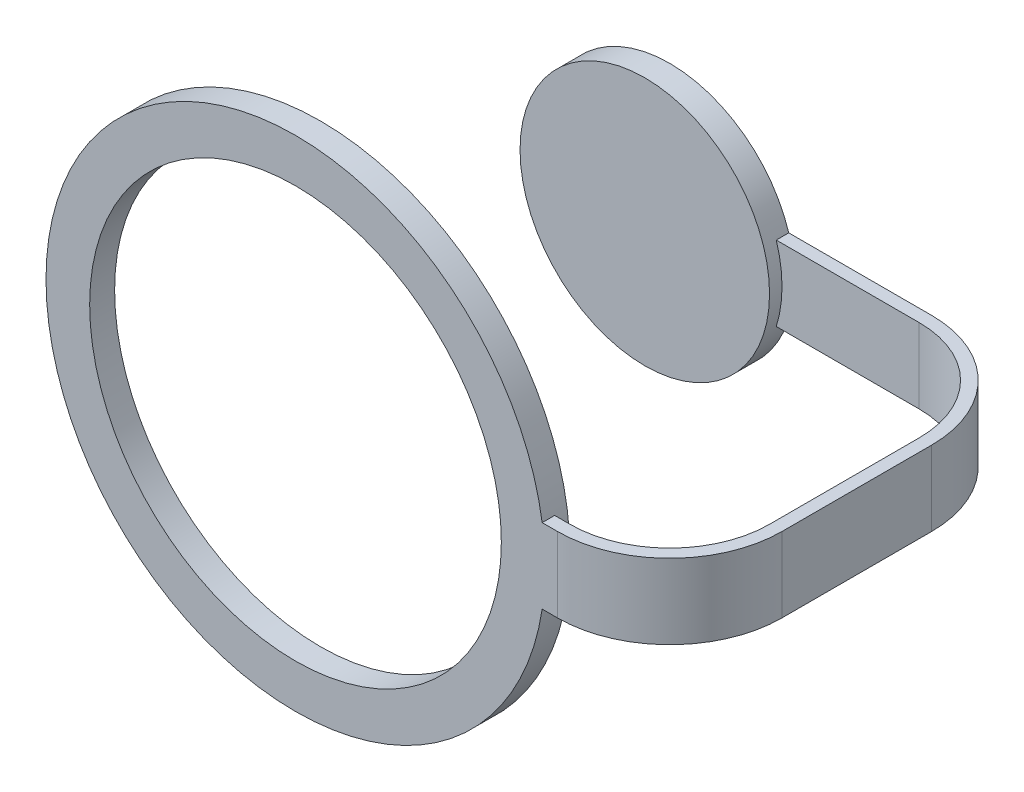
ISO-10303-21;
HEADER;
FILE_DESCRIPTION(('STEP AP214'),'2;1');
FILE_NAME('part.step','',(''),(''),'','','');
FILE_SCHEMA(('AUTOMOTIVE_DESIGN { 1 0 10303 214 1 1 1 1 }'));
ENDSEC;
DATA;
#1=APPLICATION_CONTEXT('core data for automotive mechanical design processes');
#2=APPLICATION_PROTOCOL_DEFINITION('international standard','automotive_design',2000,#1);
#3=PRODUCT_CONTEXT('',#1,'mechanical');
#4=PRODUCT('Part','Part','',(#3));
#5=PRODUCT_RELATED_PRODUCT_CATEGORY('part','',(#4));
#6=PRODUCT_DEFINITION_FORMATION('','',#4);
#7=PRODUCT_DEFINITION_CONTEXT('part definition',#1,'design');
#8=PRODUCT_DEFINITION('design','',#6,#7);
#9=PRODUCT_DEFINITION_SHAPE('','',#8);
#10=(LENGTH_UNIT() NAMED_UNIT(*) SI_UNIT(.MILLI.,.METRE.));
#11=(NAMED_UNIT(*) PLANE_ANGLE_UNIT() SI_UNIT($,.RADIAN.));
#12=(NAMED_UNIT(*) SI_UNIT($,.STERADIAN.) SOLID_ANGLE_UNIT());
#13=UNCERTAINTY_MEASURE_WITH_UNIT(LENGTH_MEASURE(1.E-05),#10,'distance_accuracy_value','');
#14=(GEOMETRIC_REPRESENTATION_CONTEXT(3) GLOBAL_UNCERTAINTY_ASSIGNED_CONTEXT((#13)) GLOBAL_UNIT_ASSIGNED_CONTEXT((#10,
#11,#12)) REPRESENTATION_CONTEXT('',''));
#15=CARTESIAN_POINT('',(0.,0.,0.));
#16=DIRECTION('',(0.,0.,1.));
#17=DIRECTION('',(1.,0.,0.));
#18=AXIS2_PLACEMENT_3D('',#15,#16,#17);
#19=CARTESIAN_POINT('',(0.,0.,14.));
#20=DIRECTION('',(0.,0.,1.));
#21=DIRECTION('',(1.,0.,0.));
#22=AXIS2_PLACEMENT_3D('',#19,#20,#21);
#23=PLANE('',#22);
#24=CARTESIAN_POINT('',(0.,0.,14.));
#25=DIRECTION('',(0.,0.,1.));
#26=DIRECTION('',(1.,0.,0.));
#27=AXIS2_PLACEMENT_3D('',#24,#25,#26);
#28=CIRCLE('',#27,10.);
#29=CARTESIAN_POINT('',(9.88685996664259,1.5,14.));
#30=VERTEX_POINT('',#29);
#31=CARTESIAN_POINT('',(9.88685996664259,-1.5,14.));
#32=VERTEX_POINT('',#31);
#33=EDGE_CURVE('E210',#30,#32,#28,.T.);
#34=ORIENTED_EDGE('',*,*,#33,.T.);
#35=DIRECTION('',(1.,0.,0.));
#36=VECTOR('',#35,1.);
#37=CARTESIAN_POINT('',(10.,-1.5,14.));
#38=LINE('',#37,#36);
#39=CARTESIAN_POINT('',(10.5,-1.5,14.));
#40=VERTEX_POINT('',#39);
#41=EDGE_CURVE('E162',#32,#40,#38,.T.);
#42=ORIENTED_EDGE('',*,*,#41,.T.);
#43=DIRECTION('',(0.,1.,0.));
#44=VECTOR('',#43,1.);
#45=CARTESIAN_POINT('',(10.5,-1.5,14.));
#46=LINE('',#45,#44);
#47=CARTESIAN_POINT('',(10.5,1.5,14.));
#48=VERTEX_POINT('',#47);
#49=EDGE_CURVE('E185',#40,#48,#46,.T.);
#50=ORIENTED_EDGE('',*,*,#49,.T.);
#51=DIRECTION('',(1.,0.,0.));
#52=VECTOR('',#51,1.);
#53=CARTESIAN_POINT('',(10.,1.5,14.));
#54=LINE('',#53,#52);
#55=EDGE_CURVE('E218',#30,#48,#54,.T.);
#56=ORIENTED_EDGE('',*,*,#55,.F.);
#57=EDGE_LOOP('',(#34,#42,#50,#56));
#58=FACE_BOUND('',#57,.T.);
#59=CARTESIAN_POINT('',(0.,0.,14.));
#60=DIRECTION('',(0.,0.,1.));
#61=DIRECTION('',(1.,0.,0.));
#62=AXIS2_PLACEMENT_3D('',#59,#60,#61);
#63=CIRCLE('',#62,8.25);
#64=CARTESIAN_POINT('',(8.25,0.,14.));
#65=VERTEX_POINT('',#64);
#66=EDGE_CURVE('E204',#65,#65,#63,.T.);
#67=ORIENTED_EDGE('',*,*,#66,.F.);
#68=EDGE_LOOP('',(#67));
#69=FACE_BOUND('',#68,.T.);
#70=ADVANCED_FACE('F32',(#58,#69),#23,.T.);
#71=CARTESIAN_POINT('',(0.,0.,13.));
#72=DIRECTION('',(0.,0.,1.));
#73=DIRECTION('',(1.,0.,0.));
#74=AXIS2_PLACEMENT_3D('',#71,#72,#73);
#75=PLANE('',#74);
#76=CARTESIAN_POINT('',(0.,0.,13.));
#77=DIRECTION('',(0.,0.,1.));
#78=DIRECTION('',(1.,0.,0.));
#79=AXIS2_PLACEMENT_3D('',#76,#77,#78);
#80=CIRCLE('',#79,10.);
#81=CARTESIAN_POINT('',(10.,0.,13.));
#82=VERTEX_POINT('',#81);
#83=EDGE_CURVE('E207',#82,#82,#80,.T.);
#84=ORIENTED_EDGE('',*,*,#83,.F.);
#85=EDGE_LOOP('',(#84));
#86=FACE_BOUND('',#85,.T.);
#87=CARTESIAN_POINT('',(0.,0.,13.));
#88=DIRECTION('',(0.,0.,1.));
#89=DIRECTION('',(1.,0.,0.));
#90=AXIS2_PLACEMENT_3D('',#87,#88,#89);
#91=CIRCLE('',#90,8.25);
#92=CARTESIAN_POINT('',(8.25,0.,13.));
#93=VERTEX_POINT('',#92);
#94=EDGE_CURVE('E188',#93,#93,#91,.T.);
#95=ORIENTED_EDGE('',*,*,#94,.T.);
#96=EDGE_LOOP('',(#95));
#97=FACE_BOUND('',#96,.T.);
#98=ADVANCED_FACE('F260',(#86,#97),#75,.F.);
#99=CARTESIAN_POINT('',(0.,0.,14.));
#100=DIRECTION('',(0.,0.,-1.));
#101=DIRECTION('',(-1.,0.,0.));
#102=AXIS2_PLACEMENT_3D('',#99,#100,#101);
#103=CYLINDRICAL_SURFACE('',#102,10.);
#104=CARTESIAN_POINT('',(0.,0.,13.5));
#105=DIRECTION('',(0.,0.,-1.));
#106=DIRECTION('',(-1.,0.,0.));
#107=AXIS2_PLACEMENT_3D('',#104,#105,#106);
#108=CIRCLE('',#107,10.);
#109=CARTESIAN_POINT('',(9.88685996664259,1.5,13.5));
#110=VERTEX_POINT('',#109);
#111=CARTESIAN_POINT('',(9.88685996664259,-1.5,13.5));
#112=VERTEX_POINT('',#111);
#113=EDGE_CURVE('E40',#110,#112,#108,.T.);
#114=ORIENTED_EDGE('',*,*,#113,.T.);
#115=DIRECTION('',(0.,0.,-1.));
#116=VECTOR('',#115,1.);
#117=CARTESIAN_POINT('',(9.88685996664259,-1.5,14.));
#118=LINE('',#117,#116);
#119=EDGE_CURVE('E11',#112,#32,#118,.F.);
#120=ORIENTED_EDGE('',*,*,#119,.T.);
#121=ORIENTED_EDGE('',*,*,#33,.F.);
#122=DIRECTION('',(0.,0.,-1.));
#123=VECTOR('',#122,1.);
#124=CARTESIAN_POINT('',(9.88685996664259,1.5,14.));
#125=LINE('',#124,#123);
#126=EDGE_CURVE('E50',#110,#30,#125,.F.);
#127=ORIENTED_EDGE('',*,*,#126,.F.);
#128=EDGE_LOOP('',(#114,#120,#121,#127));
#129=FACE_BOUND('',#128,.T.);
#130=ORIENTED_EDGE('',*,*,#83,.T.);
#131=EDGE_LOOP('',(#130));
#132=FACE_BOUND('',#131,.T.);
#133=ADVANCED_FACE('F34',(#129,#132),#103,.T.);
#134=CARTESIAN_POINT('',(0.,0.,14.));
#135=DIRECTION('',(0.,0.,-1.));
#136=DIRECTION('',(-1.,0.,0.));
#137=AXIS2_PLACEMENT_3D('',#134,#135,#136);
#138=CYLINDRICAL_SURFACE('',#137,8.25);
#139=ORIENTED_EDGE('',*,*,#66,.T.);
#140=EDGE_LOOP('',(#139));
#141=FACE_BOUND('',#140,.T.);
#142=ORIENTED_EDGE('',*,*,#94,.F.);
#143=EDGE_LOOP('',(#142));
#144=FACE_BOUND('',#143,.T.);
#145=ADVANCED_FACE('F267',(#141,#144),#138,.F.);
#146=CARTESIAN_POINT('',(10.5,-1.5,9.5));
#147=DIRECTION('',(0.,-1.,0.));
#148=DIRECTION('',(0.,0.,-1.));
#149=AXIS2_PLACEMENT_3D('',#146,#147,#148);
#150=PLANE('',#149);
#151=DIRECTION('',(0.,0.,1.));
#152=VECTOR('',#151,1.);
#153=CARTESIAN_POINT('',(4.76969600708473,-1.5,-1.));
#154=LINE('',#153,#152);
#155=CARTESIAN_POINT('',(4.76969600708473,-1.5,-1.));
#156=VERTEX_POINT('',#155);
#157=CARTESIAN_POINT('',(4.76969600708473,-1.5,-0.5));
#158=VERTEX_POINT('',#157);
#159=EDGE_CURVE('E127',#156,#158,#154,.T.);
#160=ORIENTED_EDGE('',*,*,#159,.F.);
#161=DIRECTION('',(-1.,0.,0.));
#162=VECTOR('',#161,1.);
#163=CARTESIAN_POINT('',(10.5,-1.5,-1.));
#164=LINE('',#163,#162);
#165=CARTESIAN_POINT('',(10.5,-1.5,-1.));
#166=VERTEX_POINT('',#165);
#167=EDGE_CURVE('E135',#166,#156,#164,.T.);
#168=ORIENTED_EDGE('',*,*,#167,.F.);
#169=CARTESIAN_POINT('',(10.5,-1.5,3.5));
#170=DIRECTION('',(0.,1.,0.));
#171=DIRECTION('',(0.,0.,-1.));
#172=AXIS2_PLACEMENT_3D('',#169,#170,#171);
#173=CIRCLE('',#172,4.5);
#174=CARTESIAN_POINT('',(15.,-1.5,3.5));
#175=VERTEX_POINT('',#174);
#176=EDGE_CURVE('E170',#175,#166,#173,.T.);
#177=ORIENTED_EDGE('',*,*,#176,.F.);
#178=DIRECTION('',(0.,0.,-1.));
#179=VECTOR('',#178,1.);
#180=CARTESIAN_POINT('',(15.,-1.5,9.5));
#181=LINE('',#180,#179);
#182=CARTESIAN_POINT('',(15.,-1.5,9.5));
#183=VERTEX_POINT('',#182);
#184=EDGE_CURVE('E167',#183,#175,#181,.T.);
#185=ORIENTED_EDGE('',*,*,#184,.F.);
#186=CARTESIAN_POINT('',(10.5,-1.5,9.5));
#187=DIRECTION('',(0.,1.,0.));
#188=DIRECTION('',(0.,0.,-1.));
#189=AXIS2_PLACEMENT_3D('',#186,#187,#188);
#190=CIRCLE('',#189,4.5);
#191=EDGE_CURVE('E164',#40,#183,#190,.T.);
#192=ORIENTED_EDGE('',*,*,#191,.F.);
#193=ORIENTED_EDGE('',*,*,#41,.F.);
#194=ORIENTED_EDGE('',*,*,#119,.F.);
#195=DIRECTION('',(-1.,0.,0.));
#196=VECTOR('',#195,1.);
#197=CARTESIAN_POINT('',(9.7,-1.5,13.5));
#198=LINE('',#197,#196);
#199=CARTESIAN_POINT('',(10.5,-1.5,13.5));
#200=VERTEX_POINT('',#199);
#201=EDGE_CURVE('E159',#200,#112,#198,.T.);
#202=ORIENTED_EDGE('',*,*,#201,.F.);
#203=CARTESIAN_POINT('',(10.5,-1.5,9.5));
#204=DIRECTION('',(0.,-1.,0.));
#205=DIRECTION('',(0.,0.,-1.));
#206=AXIS2_PLACEMENT_3D('',#203,#204,#205);
#207=CIRCLE('',#206,4.);
#208=CARTESIAN_POINT('',(14.5,-1.5,9.5));
#209=VERTEX_POINT('',#208);
#210=EDGE_CURVE('E182',#209,#200,#207,.T.);
#211=ORIENTED_EDGE('',*,*,#210,.F.);
#212=DIRECTION('',(0.,0.,1.));
#213=VECTOR('',#212,1.);
#214=CARTESIAN_POINT('',(14.5,-1.5,9.5));
#215=LINE('',#214,#213);
#216=CARTESIAN_POINT('',(14.5,-1.5,3.5));
#217=VERTEX_POINT('',#216);
#218=EDGE_CURVE('E179',#217,#209,#215,.T.);
#219=ORIENTED_EDGE('',*,*,#218,.F.);
#220=CARTESIAN_POINT('',(10.5,-1.5,3.5));
#221=DIRECTION('',(0.,-1.,0.));
#222=DIRECTION('',(0.,0.,-1.));
#223=AXIS2_PLACEMENT_3D('',#220,#221,#222);
#224=CIRCLE('',#223,4.);
#225=CARTESIAN_POINT('',(10.5,-1.5,-0.5));
#226=VERTEX_POINT('',#225);
#227=EDGE_CURVE('E176',#226,#217,#224,.T.);
#228=ORIENTED_EDGE('',*,*,#227,.F.);
#229=DIRECTION('',(1.,0.,0.));
#230=VECTOR('',#229,1.);
#231=CARTESIAN_POINT('',(5.,-1.5,-0.5));
#232=LINE('',#231,#230);
#233=EDGE_CURVE('E174',#158,#226,#232,.T.);
#234=ORIENTED_EDGE('',*,*,#233,.F.);
#235=EDGE_LOOP('',(#160,#168,#177,#185,#192,#193,#194,#202,#211,#219,#228,#234));
#236=FACE_BOUND('',#235,.T.);
#237=ADVANCED_FACE('F237',(#236),#150,.T.);
#238=CARTESIAN_POINT('',(10.5,1.5,9.5));
#239=DIRECTION('',(0.,-1.,0.));
#240=DIRECTION('',(0.,0.,-1.));
#241=AXIS2_PLACEMENT_3D('',#238,#239,#240);
#242=PLANE('',#241);
#243=DIRECTION('',(-1.,0.,0.));
#244=VECTOR('',#243,1.);
#245=CARTESIAN_POINT('',(10.5,1.5,-1.));
#246=LINE('',#245,#244);
#247=CARTESIAN_POINT('',(10.5,1.5,-1.));
#248=VERTEX_POINT('',#247);
#249=CARTESIAN_POINT('',(4.76969600708473,1.5,-1.));
#250=VERTEX_POINT('',#249);
#251=EDGE_CURVE('E133',#248,#250,#246,.T.);
#252=ORIENTED_EDGE('',*,*,#251,.T.);
#253=DIRECTION('',(0.,0.,1.));
#254=VECTOR('',#253,1.);
#255=CARTESIAN_POINT('',(4.76969600708473,1.5,-1.));
#256=LINE('',#255,#254);
#257=CARTESIAN_POINT('',(4.76969600708473,1.5,-0.5));
#258=VERTEX_POINT('',#257);
#259=EDGE_CURVE('E116',#250,#258,#256,.T.);
#260=ORIENTED_EDGE('',*,*,#259,.T.);
#261=DIRECTION('',(1.,0.,0.));
#262=VECTOR('',#261,1.);
#263=CARTESIAN_POINT('',(5.,1.5,-0.5));
#264=LINE('',#263,#262);
#265=CARTESIAN_POINT('',(10.5,1.5,-0.5));
#266=VERTEX_POINT('',#265);
#267=EDGE_CURVE('E143',#258,#266,#264,.T.);
#268=ORIENTED_EDGE('',*,*,#267,.T.);
#269=CARTESIAN_POINT('',(10.5,1.5,3.5));
#270=DIRECTION('',(0.,-1.,0.));
#271=DIRECTION('',(0.,0.,-1.));
#272=AXIS2_PLACEMENT_3D('',#269,#270,#271);
#273=CIRCLE('',#272,4.);
#274=CARTESIAN_POINT('',(14.5,1.5,3.5));
#275=VERTEX_POINT('',#274);
#276=EDGE_CURVE('E145',#266,#275,#273,.T.);
#277=ORIENTED_EDGE('',*,*,#276,.T.);
#278=DIRECTION('',(0.,0.,1.));
#279=VECTOR('',#278,1.);
#280=CARTESIAN_POINT('',(14.5,1.5,9.5));
#281=LINE('',#280,#279);
#282=CARTESIAN_POINT('',(14.5,1.5,9.5));
#283=VERTEX_POINT('',#282);
#284=EDGE_CURVE('E153',#275,#283,#281,.T.);
#285=ORIENTED_EDGE('',*,*,#284,.T.);
#286=CARTESIAN_POINT('',(10.5,1.5,9.5));
#287=DIRECTION('',(0.,-1.,0.));
#288=DIRECTION('',(0.,0.,-1.));
#289=AXIS2_PLACEMENT_3D('',#286,#287,#288);
#290=CIRCLE('',#289,4.);
#291=CARTESIAN_POINT('',(10.5,1.5,13.5));
#292=VERTEX_POINT('',#291);
#293=EDGE_CURVE('E156',#283,#292,#290,.T.);
#294=ORIENTED_EDGE('',*,*,#293,.T.);
#295=DIRECTION('',(-1.,0.,0.));
#296=VECTOR('',#295,1.);
#297=CARTESIAN_POINT('',(9.7,1.5,13.5));
#298=LINE('',#297,#296);
#299=EDGE_CURVE('E220',#292,#110,#298,.T.);
#300=ORIENTED_EDGE('',*,*,#299,.T.);
#301=ORIENTED_EDGE('',*,*,#126,.T.);
#302=ORIENTED_EDGE('',*,*,#55,.T.);
#303=CARTESIAN_POINT('',(10.5,1.5,9.5));
#304=DIRECTION('',(0.,1.,0.));
#305=DIRECTION('',(0.,0.,-1.));
#306=AXIS2_PLACEMENT_3D('',#303,#304,#305);
#307=CIRCLE('',#306,4.5);
#308=CARTESIAN_POINT('',(15.,1.5,9.5));
#309=VERTEX_POINT('',#308);
#310=EDGE_CURVE('E226',#48,#309,#307,.T.);
#311=ORIENTED_EDGE('',*,*,#310,.T.);
#312=DIRECTION('',(0.,0.,-1.));
#313=VECTOR('',#312,1.);
#314=CARTESIAN_POINT('',(15.,1.5,9.5));
#315=LINE('',#314,#313);
#316=CARTESIAN_POINT('',(15.,1.5,3.5));
#317=VERTEX_POINT('',#316);
#318=EDGE_CURVE('E147',#309,#317,#315,.T.);
#319=ORIENTED_EDGE('',*,*,#318,.T.);
#320=CARTESIAN_POINT('',(10.5,1.5,3.5));
#321=DIRECTION('',(0.,1.,0.));
#322=DIRECTION('',(0.,0.,-1.));
#323=AXIS2_PLACEMENT_3D('',#320,#321,#322);
#324=CIRCLE('',#323,4.5);
#325=EDGE_CURVE('E142',#317,#248,#324,.T.);
#326=ORIENTED_EDGE('',*,*,#325,.T.);
#327=EDGE_LOOP('',(#252,#260,#268,#277,#285,#294,#300,#301,#302,#311,#319,#326));
#328=FACE_BOUND('',#327,.T.);
#329=ADVANCED_FACE('F139',(#328),#242,.F.);
#330=CARTESIAN_POINT('',(10.,-1.5,13.5));
#331=DIRECTION('',(0.,0.,-1.));
#332=DIRECTION('',(-1.,0.,0.));
#333=AXIS2_PLACEMENT_3D('',#330,#331,#332);
#334=PLANE('',#333);
#335=ORIENTED_EDGE('',*,*,#113,.F.);
#336=ORIENTED_EDGE('',*,*,#299,.F.);
#337=DIRECTION('',(0.,1.,0.));
#338=VECTOR('',#337,1.);
#339=CARTESIAN_POINT('',(10.5,-1.5,13.5));
#340=LINE('',#339,#338);
#341=EDGE_CURVE('E186',#200,#292,#340,.T.);
#342=ORIENTED_EDGE('',*,*,#341,.F.);
#343=ORIENTED_EDGE('',*,*,#201,.T.);
#344=EDGE_LOOP('',(#335,#336,#342,#343));
#345=FACE_BOUND('',#344,.T.);
#346=ADVANCED_FACE('F292',(#345),#334,.T.);
#347=CARTESIAN_POINT('',(10.5,-1.5,9.5));
#348=DIRECTION('',(0.,1.,0.));
#349=DIRECTION('',(0.,0.,1.));
#350=AXIS2_PLACEMENT_3D('',#347,#348,#349);
#351=CYLINDRICAL_SURFACE('',#350,4.);
#352=ORIENTED_EDGE('',*,*,#341,.T.);
#353=ORIENTED_EDGE('',*,*,#293,.F.);
#354=DIRECTION('',(0.,1.,0.));
#355=VECTOR('',#354,1.);
#356=CARTESIAN_POINT('',(14.5,-1.5,9.5));
#357=LINE('',#356,#355);
#358=EDGE_CURVE('E189',#209,#283,#357,.T.);
#359=ORIENTED_EDGE('',*,*,#358,.F.);
#360=ORIENTED_EDGE('',*,*,#210,.T.);
#361=EDGE_LOOP('',(#352,#353,#359,#360));
#362=FACE_BOUND('',#361,.T.);
#363=ADVANCED_FACE('F288',(#362),#351,.F.);
#364=CARTESIAN_POINT('',(14.5,-1.5,9.5));
#365=DIRECTION('',(-1.,0.,0.));
#366=DIRECTION('',(0.,0.,1.));
#367=AXIS2_PLACEMENT_3D('',#364,#365,#366);
#368=PLANE('',#367);
#369=ORIENTED_EDGE('',*,*,#358,.T.);
#370=ORIENTED_EDGE('',*,*,#284,.F.);
#371=DIRECTION('',(0.,1.,0.));
#372=VECTOR('',#371,1.);
#373=CARTESIAN_POINT('',(14.5,-1.5,3.5));
#374=LINE('',#373,#372);
#375=EDGE_CURVE('E191',#217,#275,#374,.T.);
#376=ORIENTED_EDGE('',*,*,#375,.F.);
#377=ORIENTED_EDGE('',*,*,#218,.T.);
#378=EDGE_LOOP('',(#369,#370,#376,#377));
#379=FACE_BOUND('',#378,.T.);
#380=ADVANCED_FACE('F284',(#379),#368,.T.);
#381=CARTESIAN_POINT('',(10.5,-1.5,3.5));
#382=DIRECTION('',(0.,1.,0.));
#383=DIRECTION('',(0.,0.,1.));
#384=AXIS2_PLACEMENT_3D('',#381,#382,#383);
#385=CYLINDRICAL_SURFACE('',#384,4.);
#386=ORIENTED_EDGE('',*,*,#375,.T.);
#387=ORIENTED_EDGE('',*,*,#276,.F.);
#388=DIRECTION('',(0.,1.,0.));
#389=VECTOR('',#388,1.);
#390=CARTESIAN_POINT('',(10.5,-1.5,-0.5));
#391=LINE('',#390,#389);
#392=EDGE_CURVE('E193',#226,#266,#391,.T.);
#393=ORIENTED_EDGE('',*,*,#392,.F.);
#394=ORIENTED_EDGE('',*,*,#227,.T.);
#395=EDGE_LOOP('',(#386,#387,#393,#394));
#396=FACE_BOUND('',#395,.T.);
#397=ADVANCED_FACE('F280',(#396),#385,.F.);
#398=CARTESIAN_POINT('',(10.5,-1.5,-0.500000000000001));
#399=DIRECTION('',(0.,0.,1.));
#400=DIRECTION('',(1.,0.,0.));
#401=AXIS2_PLACEMENT_3D('',#398,#399,#400);
#402=PLANE('',#401);
#403=CARTESIAN_POINT('',(0.,0.,-0.5));
#404=DIRECTION('',(0.,0.,1.));
#405=DIRECTION('',(1.,0.,0.));
#406=AXIS2_PLACEMENT_3D('',#403,#404,#405);
#407=CIRCLE('',#406,5.);
#408=EDGE_CURVE('E123',#158,#258,#407,.T.);
#409=ORIENTED_EDGE('',*,*,#408,.F.);
#410=ORIENTED_EDGE('',*,*,#233,.T.);
#411=ORIENTED_EDGE('',*,*,#392,.T.);
#412=ORIENTED_EDGE('',*,*,#267,.F.);
#413=EDGE_LOOP('',(#409,#410,#411,#412));
#414=FACE_BOUND('',#413,.T.);
#415=ADVANCED_FACE('F277',(#414),#402,.T.);
#416=CARTESIAN_POINT('',(4.7,-1.5,-0.999999999999999));
#417=DIRECTION('',(0.,0.,-1.));
#418=DIRECTION('',(-1.,0.,0.));
#419=AXIS2_PLACEMENT_3D('',#416,#417,#418);
#420=PLANE('',#419);
#421=ORIENTED_EDGE('',*,*,#167,.T.);
#422=CARTESIAN_POINT('',(0.,0.,-1.));
#423=DIRECTION('',(0.,0.,1.));
#424=DIRECTION('',(1.,0.,0.));
#425=AXIS2_PLACEMENT_3D('',#422,#423,#424);
#426=CIRCLE('',#425,5.);
#427=EDGE_CURVE('E120',#250,#156,#426,.T.);
#428=ORIENTED_EDGE('',*,*,#427,.F.);
#429=ORIENTED_EDGE('',*,*,#251,.F.);
#430=DIRECTION('',(0.,1.,0.));
#431=VECTOR('',#430,1.);
#432=CARTESIAN_POINT('',(10.5,-1.5,-1.));
#433=LINE('',#432,#431);
#434=EDGE_CURVE('E196',#166,#248,#433,.T.);
#435=ORIENTED_EDGE('',*,*,#434,.F.);
#436=EDGE_LOOP('',(#421,#428,#429,#435));
#437=FACE_BOUND('',#436,.T.);
#438=ADVANCED_FACE('F132',(#437),#420,.T.);
#439=CARTESIAN_POINT('',(10.5,-1.5,3.5));
#440=DIRECTION('',(0.,1.,0.));
#441=DIRECTION('',(0.,0.,1.));
#442=AXIS2_PLACEMENT_3D('',#439,#440,#441);
#443=CYLINDRICAL_SURFACE('',#442,4.5);
#444=ORIENTED_EDGE('',*,*,#434,.T.);
#445=ORIENTED_EDGE('',*,*,#325,.F.);
#446=DIRECTION('',(0.,1.,0.));
#447=VECTOR('',#446,1.);
#448=CARTESIAN_POINT('',(15.,-1.5,3.5));
#449=LINE('',#448,#447);
#450=EDGE_CURVE('E198',#175,#317,#449,.T.);
#451=ORIENTED_EDGE('',*,*,#450,.F.);
#452=ORIENTED_EDGE('',*,*,#176,.T.);
#453=EDGE_LOOP('',(#444,#445,#451,#452));
#454=FACE_BOUND('',#453,.T.);
#455=ADVANCED_FACE('F234',(#454),#443,.T.);
#456=CARTESIAN_POINT('',(15.,-1.5,9.5));
#457=DIRECTION('',(1.,0.,0.));
#458=DIRECTION('',(0.,0.,-1.));
#459=AXIS2_PLACEMENT_3D('',#456,#457,#458);
#460=PLANE('',#459);
#461=ORIENTED_EDGE('',*,*,#450,.T.);
#462=ORIENTED_EDGE('',*,*,#318,.F.);
#463=DIRECTION('',(0.,1.,0.));
#464=VECTOR('',#463,1.);
#465=CARTESIAN_POINT('',(15.,-1.5,9.5));
#466=LINE('',#465,#464);
#467=EDGE_CURVE('E200',#183,#309,#466,.T.);
#468=ORIENTED_EDGE('',*,*,#467,.F.);
#469=ORIENTED_EDGE('',*,*,#184,.T.);
#470=EDGE_LOOP('',(#461,#462,#468,#469));
#471=FACE_BOUND('',#470,.T.);
#472=ADVANCED_FACE('F255',(#471),#460,.T.);
#473=CARTESIAN_POINT('',(10.5,-1.5,9.5));
#474=DIRECTION('',(0.,1.,0.));
#475=DIRECTION('',(0.,0.,1.));
#476=AXIS2_PLACEMENT_3D('',#473,#474,#475);
#477=CYLINDRICAL_SURFACE('',#476,4.5);
#478=ORIENTED_EDGE('',*,*,#467,.T.);
#479=ORIENTED_EDGE('',*,*,#310,.F.);
#480=ORIENTED_EDGE('',*,*,#49,.F.);
#481=ORIENTED_EDGE('',*,*,#191,.T.);
#482=EDGE_LOOP('',(#478,#479,#480,#481));
#483=FACE_BOUND('',#482,.T.);
#484=ADVANCED_FACE('F248',(#483),#477,.T.);
#485=CARTESIAN_POINT('',(0.,0.,-1.));
#486=DIRECTION('',(0.,0.,1.));
#487=DIRECTION('',(1.,0.,0.));
#488=AXIS2_PLACEMENT_3D('',#485,#486,#487);
#489=CYLINDRICAL_SURFACE('',#488,5.);
#490=ORIENTED_EDGE('',*,*,#427,.T.);
#491=ORIENTED_EDGE('',*,*,#159,.T.);
#492=ORIENTED_EDGE('',*,*,#408,.T.);
#493=ORIENTED_EDGE('',*,*,#259,.F.);
#494=EDGE_LOOP('',(#490,#491,#492,#493));
#495=FACE_BOUND('',#494,.T.);
#496=CARTESIAN_POINT('',(0.,0.,0.));
#497=DIRECTION('',(0.,0.,1.));
#498=DIRECTION('',(1.,0.,0.));
#499=AXIS2_PLACEMENT_3D('',#496,#497,#498);
#500=CIRCLE('',#499,5.);
#501=CARTESIAN_POINT('',(5.,0.,0.));
#502=VERTEX_POINT('',#501);
#503=EDGE_CURVE('E136',#502,#502,#500,.T.);
#504=ORIENTED_EDGE('',*,*,#503,.F.);
#505=EDGE_LOOP('',(#504));
#506=FACE_BOUND('',#505,.T.);
#507=ADVANCED_FACE('F118',(#495,#506),#489,.T.);
#508=CARTESIAN_POINT('',(0.,0.,0.));
#509=DIRECTION('',(0.,0.,1.));
#510=DIRECTION('',(1.,0.,0.));
#511=AXIS2_PLACEMENT_3D('',#508,#509,#510);
#512=PLANE('',#511);
#513=ORIENTED_EDGE('',*,*,#503,.T.);
#514=EDGE_LOOP('',(#513));
#515=FACE_BOUND('',#514,.T.);
#516=ADVANCED_FACE('F246',(#515),#512,.T.);
#517=CLOSED_SHELL('',(#70,#98,#133,#145,#237,#329,#346,#363,#380,#397,#415,#438,#455,#472,#484,
#507,#516));
#518=MANIFOLD_SOLID_BREP('B2',#517);
#519=ADVANCED_BREP_SHAPE_REPRESENTATION('',(#18,#518),#14);
#520=SHAPE_DEFINITION_REPRESENTATION(#9,#519);
ENDSEC;
END-ISO-10303-21;
